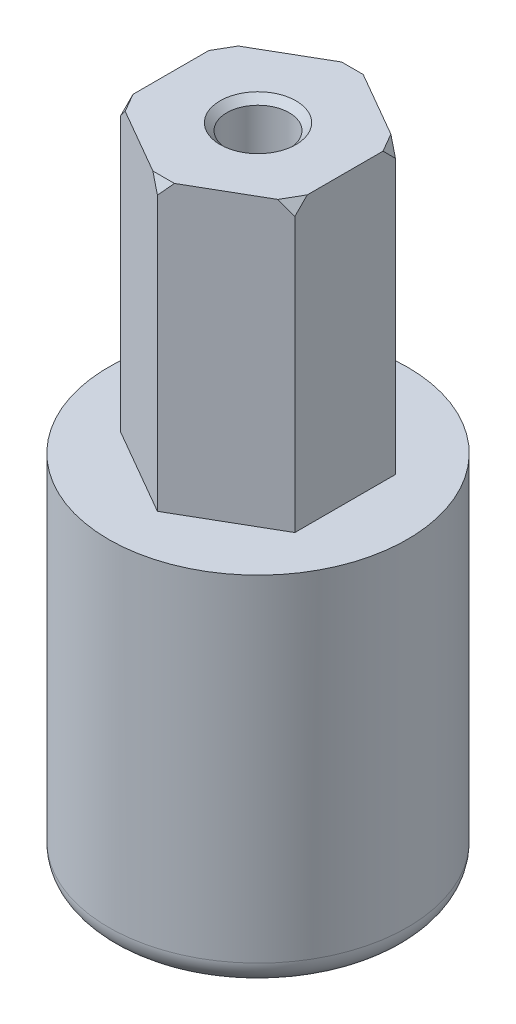
ISO-10303-21;
HEADER;
FILE_DESCRIPTION(('STEP AP214'),'2;1');
FILE_NAME('part.step','',(''),(''),'','','');
FILE_SCHEMA(('AUTOMOTIVE_DESIGN { 1 0 10303 214 1 1 1 1 }'));
ENDSEC;
DATA;
#1=APPLICATION_CONTEXT('core data for automotive mechanical design processes');
#2=APPLICATION_PROTOCOL_DEFINITION('international standard','automotive_design',2000,#1);
#3=PRODUCT_CONTEXT('',#1,'mechanical');
#4=PRODUCT('Part','Part','',(#3));
#5=PRODUCT_RELATED_PRODUCT_CATEGORY('part','',(#4));
#6=PRODUCT_DEFINITION_FORMATION('','',#4);
#7=PRODUCT_DEFINITION_CONTEXT('part definition',#1,'design');
#8=PRODUCT_DEFINITION('design','',#6,#7);
#9=PRODUCT_DEFINITION_SHAPE('','',#8);
#10=(LENGTH_UNIT() NAMED_UNIT(*) SI_UNIT(.MILLI.,.METRE.));
#11=(NAMED_UNIT(*) PLANE_ANGLE_UNIT() SI_UNIT($,.RADIAN.));
#12=(NAMED_UNIT(*) SI_UNIT($,.STERADIAN.) SOLID_ANGLE_UNIT());
#13=UNCERTAINTY_MEASURE_WITH_UNIT(LENGTH_MEASURE(1.E-05),#10,'distance_accuracy_value','');
#14=(GEOMETRIC_REPRESENTATION_CONTEXT(3) GLOBAL_UNCERTAINTY_ASSIGNED_CONTEXT((#13)) GLOBAL_UNIT_ASSIGNED_CONTEXT((#10,
#11,#12)) REPRESENTATION_CONTEXT('',''));
#15=CARTESIAN_POINT('',(0.,0.,0.));
#16=DIRECTION('',(0.,0.,1.));
#17=DIRECTION('',(1.,0.,0.));
#18=AXIS2_PLACEMENT_3D('',#15,#16,#17);
#19=CARTESIAN_POINT('',(3.5,14.5,-2.02072594216369));
#20=DIRECTION('',(0.5,0.,-0.866025403784438));
#21=DIRECTION('',(-0.866025403784438,0.,-0.5));
#22=AXIS2_PLACEMENT_3D('',#19,#20,#21);
#23=PLANE('',#22);
#24=DIRECTION('',(0.,1.,0.));
#25=VECTOR('',#24,1.);
#26=CARTESIAN_POINT('',(0.,14.5,-4.04145188432738));
#27=LINE('',#26,#25);
#28=CARTESIAN_POINT('',(0.,14.5,-4.04145188432738));
#29=VERTEX_POINT('',#28);
#30=CARTESIAN_POINT('',(0.,25.5,-4.04145188432738));
#31=VERTEX_POINT('',#30);
#32=EDGE_CURVE('E192',#29,#31,#27,.T.);
#33=ORIENTED_EDGE('',*,*,#32,.T.);
#34=DIRECTION('',(0.612372435695793,0.70710678118655,0.353553390593273));
#35=VECTOR('',#34,1.);
#36=CARTESIAN_POINT('',(-3.01313972081442,22.0207259421637,-5.78108891324554));
#37=LINE('',#36,#35);
#38=CARTESIAN_POINT('',(0.433012701892216,26.,-3.79145188432738));
#39=VERTEX_POINT('',#38);
#40=EDGE_CURVE('E11',#31,#39,#37,.T.);
#41=ORIENTED_EDGE('',*,*,#40,.T.);
#42=DIRECTION('',(-0.866025403784439,0.,-0.5));
#43=VECTOR('',#42,1.);
#44=CARTESIAN_POINT('',(3.5,26.,-2.02072594216369));
#45=LINE('',#44,#43);
#46=CARTESIAN_POINT('',(3.06698729810779,26.,-2.27072594216369));
#47=VERTEX_POINT('',#46);
#48=EDGE_CURVE('E144',#47,#39,#45,.T.);
#49=ORIENTED_EDGE('',*,*,#48,.F.);
#50=DIRECTION('',(0.612372435695793,-0.707106781186549,0.353553390593273));
#51=VECTOR('',#50,1.);
#52=CARTESIAN_POINT('',(8.26313972081442,20.,0.729274057836312));
#53=LINE('',#52,#51);
#54=CARTESIAN_POINT('',(3.5,25.5,-2.02072594216369));
#55=VERTEX_POINT('',#54);
#56=EDGE_CURVE('E226',#47,#55,#53,.T.);
#57=ORIENTED_EDGE('',*,*,#56,.T.);
#58=DIRECTION('',(0.,1.,0.));
#59=VECTOR('',#58,1.);
#60=CARTESIAN_POINT('',(3.5,14.5,-2.02072594216369));
#61=LINE('',#60,#59);
#62=CARTESIAN_POINT('',(3.5,14.5,-2.02072594216369));
#63=VERTEX_POINT('',#62);
#64=EDGE_CURVE('E169',#63,#55,#61,.T.);
#65=ORIENTED_EDGE('',*,*,#64,.F.);
#66=DIRECTION('',(-0.866025403784439,0.,-0.5));
#67=VECTOR('',#66,1.);
#68=CARTESIAN_POINT('',(3.5,14.5,-2.02072594216369));
#69=LINE('',#68,#67);
#70=EDGE_CURVE('E154',#63,#29,#69,.T.);
#71=ORIENTED_EDGE('',*,*,#70,.T.);
#72=EDGE_LOOP('',(#33,#41,#49,#57,#65,#71));
#73=FACE_BOUND('',#72,.T.);
#74=ADVANCED_FACE('F41',(#73),#23,.T.);
#75=CARTESIAN_POINT('',(0.,26.,-6.));
#76=DIRECTION('',(0.,1.,0.));
#77=DIRECTION('',(0.,0.,1.));
#78=AXIS2_PLACEMENT_3D('',#75,#76,#77);
#79=PLANE('',#78);
#80=CARTESIAN_POINT('',(0.,26.,0.));
#81=DIRECTION('',(0.,1.,0.));
#82=DIRECTION('',(0.,0.,1.));
#83=AXIS2_PLACEMENT_3D('',#80,#81,#82);
#84=CIRCLE('',#83,1.525);
#85=CARTESIAN_POINT('',(0.,26.,1.525));
#86=VERTEX_POINT('',#85);
#87=EDGE_CURVE('E147',#86,#86,#84,.T.);
#88=ORIENTED_EDGE('',*,*,#87,.F.);
#89=EDGE_LOOP('',(#88));
#90=FACE_BOUND('',#89,.T.);
#91=ORIENTED_EDGE('',*,*,#48,.T.);
#92=DIRECTION('',(-1.,0.,0.));
#93=VECTOR('',#92,1.);
#94=CARTESIAN_POINT('',(0.,26.,-3.79145188432738));
#95=LINE('',#94,#93);
#96=CARTESIAN_POINT('',(-0.433012701892214,26.,-3.79145188432738));
#97=VERTEX_POINT('',#96);
#98=EDGE_CURVE('E49',#39,#97,#95,.T.);
#99=ORIENTED_EDGE('',*,*,#98,.T.);
#100=DIRECTION('',(-0.866025403784438,0.,0.5));
#101=VECTOR('',#100,1.);
#102=CARTESIAN_POINT('',(0.,26.,-4.04145188432738));
#103=LINE('',#102,#101);
#104=CARTESIAN_POINT('',(-3.06698729810778,26.,-2.27072594216369));
#105=VERTEX_POINT('',#104);
#106=EDGE_CURVE('E61',#97,#105,#103,.T.);
#107=ORIENTED_EDGE('',*,*,#106,.T.);
#108=DIRECTION('',(-0.5,0.,0.866025403784439));
#109=VECTOR('',#108,1.);
#110=CARTESIAN_POINT('',(-0.685417437700576,26.,-6.39572594216369));
#111=LINE('',#110,#109);
#112=CARTESIAN_POINT('',(-3.5,26.,-1.52072594216369));
#113=VERTEX_POINT('',#112);
#114=EDGE_CURVE('E250',#105,#113,#111,.T.);
#115=ORIENTED_EDGE('',*,*,#114,.T.);
#116=DIRECTION('',(0.,0.,1.));
#117=VECTOR('',#116,1.);
#118=CARTESIAN_POINT('',(-3.5,26.,-2.02072594216369));
#119=LINE('',#118,#117);
#120=CARTESIAN_POINT('',(-3.5,26.,1.5207259421637));
#121=VERTEX_POINT('',#120);
#122=EDGE_CURVE('E174',#113,#121,#119,.T.);
#123=ORIENTED_EDGE('',*,*,#122,.T.);
#124=DIRECTION('',(0.5,0.,0.866025403784439));
#125=VECTOR('',#124,1.);
#126=CARTESIAN_POINT('',(-5.88156986040721,26.,-2.60427405783631));
#127=LINE('',#126,#125);
#128=CARTESIAN_POINT('',(-3.06698729810778,26.,2.27072594216369));
#129=VERTEX_POINT('',#128);
#130=EDGE_CURVE('E241',#121,#129,#127,.T.);
#131=ORIENTED_EDGE('',*,*,#130,.T.);
#132=DIRECTION('',(0.866025403784438,0.,0.5));
#133=VECTOR('',#132,1.);
#134=CARTESIAN_POINT('',(-3.5,26.,2.02072594216369));
#135=LINE('',#134,#133);
#136=CARTESIAN_POINT('',(-0.433012701892229,26.,3.79145188432738));
#137=VERTEX_POINT('',#136);
#138=EDGE_CURVE('E176',#129,#137,#135,.T.);
#139=ORIENTED_EDGE('',*,*,#138,.T.);
#140=DIRECTION('',(1.,0.,0.));
#141=VECTOR('',#140,1.);
#142=CARTESIAN_POINT('',(0.,26.,3.79145188432737));
#143=LINE('',#142,#141);
#144=CARTESIAN_POINT('',(0.433012701892234,26.,3.79145188432737));
#145=VERTEX_POINT('',#144);
#146=EDGE_CURVE('E229',#137,#145,#143,.T.);
#147=ORIENTED_EDGE('',*,*,#146,.T.);
#148=DIRECTION('',(0.866025403784439,0.,-0.5));
#149=VECTOR('',#148,1.);
#150=CARTESIAN_POINT('',(0.,26.,4.04145188432738));
#151=LINE('',#150,#149);
#152=CARTESIAN_POINT('',(3.06698729810778,26.,2.2707259421637));
#153=VERTEX_POINT('',#152);
#154=EDGE_CURVE('E155',#145,#153,#151,.T.);
#155=ORIENTED_EDGE('',*,*,#154,.T.);
#156=DIRECTION('',(0.5,0.,-0.866025403784439));
#157=VECTOR('',#156,1.);
#158=CARTESIAN_POINT('',(5.88156986040721,26.,-2.60427405783631));
#159=LINE('',#158,#157);
#160=CARTESIAN_POINT('',(3.5,26.,1.5207259421637));
#161=VERTEX_POINT('',#160);
#162=EDGE_CURVE('E217',#153,#161,#159,.T.);
#163=ORIENTED_EDGE('',*,*,#162,.T.);
#164=DIRECTION('',(0.,0.,-1.));
#165=VECTOR('',#164,1.);
#166=CARTESIAN_POINT('',(3.5,26.,2.02072594216369));
#167=LINE('',#166,#165);
#168=CARTESIAN_POINT('',(3.5,26.,-1.52072594216369));
#169=VERTEX_POINT('',#168);
#170=EDGE_CURVE('E140',#161,#169,#167,.T.);
#171=ORIENTED_EDGE('',*,*,#170,.T.);
#172=DIRECTION('',(-0.5,0.,-0.866025403784439));
#173=VECTOR('',#172,1.);
#174=CARTESIAN_POINT('',(0.685417437700577,26.,-6.39572594216369));
#175=LINE('',#174,#173);
#176=EDGE_CURVE('E220',#169,#47,#175,.T.);
#177=ORIENTED_EDGE('',*,*,#176,.T.);
#178=EDGE_LOOP('',(#91,#99,#107,#115,#123,#131,#139,#147,#155,#163,#171,#177));
#179=FACE_BOUND('',#178,.T.);
#180=ADVANCED_FACE('F257',(#90,#179),#79,.T.);
#181=CARTESIAN_POINT('',(0.,14.5,-4.04145188432738));
#182=DIRECTION('',(-0.5,0.,-0.866025403784438));
#183=DIRECTION('',(-0.866025403784439,0.,0.5));
#184=AXIS2_PLACEMENT_3D('',#181,#182,#183);
#185=PLANE('',#184);
#186=ORIENTED_EDGE('',*,*,#106,.F.);
#187=DIRECTION('',(0.612372435695793,-0.707106781186549,-0.353553390593273));
#188=VECTOR('',#187,1.);
#189=CARTESIAN_POINT('',(4.76313972081442,20.,-6.79145188432738));
#190=LINE('',#189,#188);
#191=EDGE_CURVE('E255',#97,#31,#190,.T.);
#192=ORIENTED_EDGE('',*,*,#191,.T.);
#193=ORIENTED_EDGE('',*,*,#32,.F.);
#194=DIRECTION('',(-0.866025403784438,0.,0.5));
#195=VECTOR('',#194,1.);
#196=CARTESIAN_POINT('',(0.,14.5,-4.04145188432738));
#197=LINE('',#196,#195);
#198=CARTESIAN_POINT('',(-3.5,14.5,-2.02072594216369));
#199=VERTEX_POINT('',#198);
#200=EDGE_CURVE('E158',#29,#199,#197,.T.);
#201=ORIENTED_EDGE('',*,*,#200,.T.);
#202=DIRECTION('',(0.,1.,0.));
#203=VECTOR('',#202,1.);
#204=CARTESIAN_POINT('',(-3.5,14.5,-2.02072594216369));
#205=LINE('',#204,#203);
#206=CARTESIAN_POINT('',(-3.5,25.5,-2.02072594216369));
#207=VERTEX_POINT('',#206);
#208=EDGE_CURVE('E189',#199,#207,#205,.T.);
#209=ORIENTED_EDGE('',*,*,#208,.T.);
#210=DIRECTION('',(0.612372435695793,0.707106781186549,-0.353553390593273));
#211=VECTOR('',#210,1.);
#212=CARTESIAN_POINT('',(-6.51313972081442,22.0207259421637,-0.281088913245531));
#213=LINE('',#212,#211);
#214=EDGE_CURVE('E252',#207,#105,#213,.T.);
#215=ORIENTED_EDGE('',*,*,#214,.T.);
#216=EDGE_LOOP('',(#186,#192,#193,#201,#209,#215));
#217=FACE_BOUND('',#216,.T.);
#218=ADVANCED_FACE('F260',(#217),#185,.T.);
#219=CARTESIAN_POINT('',(-3.5,14.5,-2.02072594216369));
#220=DIRECTION('',(-1.,0.,0.));
#221=DIRECTION('',(0.,0.,1.));
#222=AXIS2_PLACEMENT_3D('',#219,#220,#221);
#223=PLANE('',#222);
#224=ORIENTED_EDGE('',*,*,#122,.F.);
#225=DIRECTION('',(0.,-0.707106781186549,-0.707106781186546));
#226=VECTOR('',#225,1.);
#227=CARTESIAN_POINT('',(-3.5,20.,-7.52072594216369));
#228=LINE('',#227,#226);
#229=EDGE_CURVE('E247',#113,#207,#228,.T.);
#230=ORIENTED_EDGE('',*,*,#229,.T.);
#231=ORIENTED_EDGE('',*,*,#208,.F.);
#232=DIRECTION('',(0.,0.,1.));
#233=VECTOR('',#232,1.);
#234=CARTESIAN_POINT('',(-3.5,14.5,-2.02072594216369));
#235=LINE('',#234,#233);
#236=CARTESIAN_POINT('',(-3.5,14.5,2.02072594216369));
#237=VERTEX_POINT('',#236);
#238=EDGE_CURVE('E161',#199,#237,#235,.T.);
#239=ORIENTED_EDGE('',*,*,#238,.T.);
#240=DIRECTION('',(0.,1.,0.));
#241=VECTOR('',#240,1.);
#242=CARTESIAN_POINT('',(-3.5,14.5,2.02072594216369));
#243=LINE('',#242,#241);
#244=CARTESIAN_POINT('',(-3.5,25.5,2.02072594216369));
#245=VERTEX_POINT('',#244);
#246=EDGE_CURVE('E186',#237,#245,#243,.T.);
#247=ORIENTED_EDGE('',*,*,#246,.T.);
#248=DIRECTION('',(0.,0.707106781186549,-0.707106781186546));
#249=VECTOR('',#248,1.);
#250=CARTESIAN_POINT('',(-3.5,22.0207259421637,5.50000000000001));
#251=LINE('',#250,#249);
#252=EDGE_CURVE('E244',#245,#121,#251,.T.);
#253=ORIENTED_EDGE('',*,*,#252,.T.);
#254=EDGE_LOOP('',(#224,#230,#231,#239,#247,#253));
#255=FACE_BOUND('',#254,.T.);
#256=ADVANCED_FACE('F266',(#255),#223,.T.);
#257=CARTESIAN_POINT('',(-3.5,14.5,2.02072594216369));
#258=DIRECTION('',(-0.5,0.,0.866025403784439));
#259=DIRECTION('',(0.866025403784438,0.,0.5));
#260=AXIS2_PLACEMENT_3D('',#257,#258,#259);
#261=PLANE('',#260);
#262=ORIENTED_EDGE('',*,*,#138,.F.);
#263=DIRECTION('',(-0.612372435695793,-0.707106781186549,-0.353553390593273));
#264=VECTOR('',#263,1.);
#265=CARTESIAN_POINT('',(-8.26313972081441,20.,-0.729274057836308));
#266=LINE('',#265,#264);
#267=EDGE_CURVE('E238',#129,#245,#266,.T.);
#268=ORIENTED_EDGE('',*,*,#267,.T.);
#269=ORIENTED_EDGE('',*,*,#246,.F.);
#270=DIRECTION('',(0.866025403784438,0.,0.5));
#271=VECTOR('',#270,1.);
#272=CARTESIAN_POINT('',(-3.5,14.5,2.02072594216369));
#273=LINE('',#272,#271);
#274=CARTESIAN_POINT('',(0.,14.5,4.04145188432738));
#275=VERTEX_POINT('',#274);
#276=EDGE_CURVE('E164',#237,#275,#273,.T.);
#277=ORIENTED_EDGE('',*,*,#276,.T.);
#278=DIRECTION('',(0.,1.,0.));
#279=VECTOR('',#278,1.);
#280=CARTESIAN_POINT('',(0.,14.5,4.04145188432738));
#281=LINE('',#280,#279);
#282=CARTESIAN_POINT('',(0.,25.5,4.04145188432738));
#283=VERTEX_POINT('',#282);
#284=EDGE_CURVE('E183',#275,#283,#281,.T.);
#285=ORIENTED_EDGE('',*,*,#284,.T.);
#286=DIRECTION('',(-0.612372435695793,0.707106781186549,-0.353553390593273));
#287=VECTOR('',#286,1.);
#288=CARTESIAN_POINT('',(3.01313972081441,22.0207259421637,5.78108891324554));
#289=LINE('',#288,#287);
#290=EDGE_CURVE('E235',#283,#137,#289,.T.);
#291=ORIENTED_EDGE('',*,*,#290,.T.);
#292=EDGE_LOOP('',(#262,#268,#269,#277,#285,#291));
#293=FACE_BOUND('',#292,.T.);
#294=ADVANCED_FACE('F273',(#293),#261,.T.);
#295=CARTESIAN_POINT('',(0.,14.5,4.04145188432738));
#296=DIRECTION('',(0.5,0.,0.866025403784439));
#297=DIRECTION('',(0.866025403784439,0.,-0.5));
#298=AXIS2_PLACEMENT_3D('',#295,#296,#297);
#299=PLANE('',#298);
#300=ORIENTED_EDGE('',*,*,#154,.F.);
#301=DIRECTION('',(-0.612372435695793,-0.70710678118655,0.353553390593273));
#302=VECTOR('',#301,1.);
#303=CARTESIAN_POINT('',(-4.76313972081441,20.,6.79145188432738));
#304=LINE('',#303,#302);
#305=EDGE_CURVE('E232',#145,#283,#304,.T.);
#306=ORIENTED_EDGE('',*,*,#305,.T.);
#307=ORIENTED_EDGE('',*,*,#284,.F.);
#308=DIRECTION('',(0.866025403784439,0.,-0.5));
#309=VECTOR('',#308,1.);
#310=CARTESIAN_POINT('',(0.,14.5,4.04145188432738));
#311=LINE('',#310,#309);
#312=CARTESIAN_POINT('',(3.5,14.5,2.02072594216369));
#313=VERTEX_POINT('',#312);
#314=EDGE_CURVE('E167',#275,#313,#311,.T.);
#315=ORIENTED_EDGE('',*,*,#314,.T.);
#316=DIRECTION('',(0.,1.,0.));
#317=VECTOR('',#316,1.);
#318=CARTESIAN_POINT('',(3.5,14.5,2.02072594216369));
#319=LINE('',#318,#317);
#320=CARTESIAN_POINT('',(3.5,25.5,2.02072594216369));
#321=VERTEX_POINT('',#320);
#322=EDGE_CURVE('E179',#313,#321,#319,.T.);
#323=ORIENTED_EDGE('',*,*,#322,.T.);
#324=DIRECTION('',(-0.612372435695793,0.707106781186549,0.353553390593273));
#325=VECTOR('',#324,1.);
#326=CARTESIAN_POINT('',(6.51313972081442,22.0207259421637,0.281088913245533));
#327=LINE('',#326,#325);
#328=EDGE_CURVE('E214',#321,#153,#327,.T.);
#329=ORIENTED_EDGE('',*,*,#328,.T.);
#330=EDGE_LOOP('',(#300,#306,#307,#315,#323,#329));
#331=FACE_BOUND('',#330,.T.);
#332=ADVANCED_FACE('F287',(#331),#299,.T.);
#333=CARTESIAN_POINT('',(3.5,14.5,2.02072594216369));
#334=DIRECTION('',(1.,0.,0.));
#335=DIRECTION('',(0.,0.,-1.));
#336=AXIS2_PLACEMENT_3D('',#333,#334,#335);
#337=PLANE('',#336);
#338=ORIENTED_EDGE('',*,*,#64,.T.);
#339=DIRECTION('',(0.,0.707106781186549,0.707106781186546));
#340=VECTOR('',#339,1.);
#341=CARTESIAN_POINT('',(3.5,22.0207259421637,-5.50000000000001));
#342=LINE('',#341,#340);
#343=EDGE_CURVE('E223',#55,#169,#342,.T.);
#344=ORIENTED_EDGE('',*,*,#343,.T.);
#345=ORIENTED_EDGE('',*,*,#170,.F.);
#346=DIRECTION('',(0.,-0.707106781186549,0.707106781186546));
#347=VECTOR('',#346,1.);
#348=CARTESIAN_POINT('',(3.5,20.,7.52072594216369));
#349=LINE('',#348,#347);
#350=EDGE_CURVE('E211',#161,#321,#349,.T.);
#351=ORIENTED_EDGE('',*,*,#350,.T.);
#352=ORIENTED_EDGE('',*,*,#322,.F.);
#353=DIRECTION('',(0.,0.,-1.));
#354=VECTOR('',#353,1.);
#355=CARTESIAN_POINT('',(3.5,14.5,2.02072594216369));
#356=LINE('',#355,#354);
#357=EDGE_CURVE('E151',#313,#63,#356,.T.);
#358=ORIENTED_EDGE('',*,*,#357,.T.);
#359=EDGE_LOOP('',(#338,#344,#345,#351,#352,#358));
#360=FACE_BOUND('',#359,.T.);
#361=ADVANCED_FACE('F283',(#360),#337,.T.);
#362=CARTESIAN_POINT('',(0.,0.,0.));
#363=DIRECTION('',(0.,-1.,0.));
#364=DIRECTION('',(0.,0.,-1.));
#365=AXIS2_PLACEMENT_3D('',#362,#363,#364);
#366=CYLINDRICAL_SURFACE('',#365,6.);
#367=CARTESIAN_POINT('',(0.,1.,0.));
#368=DIRECTION('',(0.,-1.,0.));
#369=DIRECTION('',(0.,0.,-1.));
#370=AXIS2_PLACEMENT_3D('',#367,#368,#369);
#371=CIRCLE('',#370,6.);
#372=CARTESIAN_POINT('',(0.,1.,-6.));
#373=VERTEX_POINT('',#372);
#374=EDGE_CURVE('E208',#373,#373,#371,.F.);
#375=ORIENTED_EDGE('',*,*,#374,.T.);
#376=EDGE_LOOP('',(#375));
#377=FACE_BOUND('',#376,.T.);
#378=CARTESIAN_POINT('',(0.,14.5,0.));
#379=DIRECTION('',(0.,1.,0.));
#380=DIRECTION('',(0.,0.,1.));
#381=AXIS2_PLACEMENT_3D('',#378,#379,#380);
#382=CIRCLE('',#381,6.);
#383=CARTESIAN_POINT('',(0.,14.5,6.));
#384=VERTEX_POINT('',#383);
#385=EDGE_CURVE('E182',#384,#384,#382,.T.);
#386=ORIENTED_EDGE('',*,*,#385,.F.);
#387=EDGE_LOOP('',(#386));
#388=FACE_BOUND('',#387,.T.);
#389=ADVANCED_FACE('F318',(#377,#388),#366,.T.);
#390=CARTESIAN_POINT('',(0.,13.,0.));
#391=DIRECTION('',(0.,-1.,0.));
#392=DIRECTION('',(0.,0.,-1.));
#393=AXIS2_PLACEMENT_3D('',#390,#391,#392);
#394=PLANE('',#393);
#395=CARTESIAN_POINT('',(0.,13.,0.));
#396=DIRECTION('',(0.,-1.,0.));
#397=DIRECTION('',(0.,0.,-1.));
#398=AXIS2_PLACEMENT_3D('',#395,#396,#397);
#399=CIRCLE('',#398,3.);
#400=CARTESIAN_POINT('',(0.,13.,-3.));
#401=VERTEX_POINT('',#400);
#402=EDGE_CURVE('E202',#401,#401,#399,.T.);
#403=ORIENTED_EDGE('',*,*,#402,.T.);
#404=EDGE_LOOP('',(#403));
#405=FACE_BOUND('',#404,.T.);
#406=ADVANCED_FACE('F324',(#405),#394,.T.);
#407=CARTESIAN_POINT('',(0.,0.,0.));
#408=DIRECTION('',(0.,-1.,0.));
#409=DIRECTION('',(0.,0.,-1.));
#410=AXIS2_PLACEMENT_3D('',#407,#408,#409);
#411=CYLINDRICAL_SURFACE('',#410,3.);
#412=CARTESIAN_POINT('',(0.,0.,0.));
#413=DIRECTION('',(0.,-1.,0.));
#414=DIRECTION('',(0.,0.,-1.));
#415=AXIS2_PLACEMENT_3D('',#412,#413,#414);
#416=CIRCLE('',#415,3.);
#417=CARTESIAN_POINT('',(0.,0.,-3.));
#418=VERTEX_POINT('',#417);
#419=EDGE_CURVE('E199',#418,#418,#416,.T.);
#420=ORIENTED_EDGE('',*,*,#419,.T.);
#421=EDGE_LOOP('',(#420));
#422=FACE_BOUND('',#421,.T.);
#423=ORIENTED_EDGE('',*,*,#402,.F.);
#424=EDGE_LOOP('',(#423));
#425=FACE_BOUND('',#424,.T.);
#426=ADVANCED_FACE('F328',(#422,#425),#411,.F.);
#427=CARTESIAN_POINT('',(0.,0.,-6.));
#428=DIRECTION('',(0.,-1.,0.));
#429=DIRECTION('',(0.,0.,-1.));
#430=AXIS2_PLACEMENT_3D('',#427,#428,#429);
#431=PLANE('',#430);
#432=CARTESIAN_POINT('',(0.,0.,0.));
#433=DIRECTION('',(0.,-1.,0.));
#434=DIRECTION('',(0.,0.,-1.));
#435=AXIS2_PLACEMENT_3D('',#432,#433,#434);
#436=CIRCLE('',#435,5.);
#437=CARTESIAN_POINT('',(0.,0.,-5.));
#438=VERTEX_POINT('',#437);
#439=EDGE_CURVE('E205',#438,#438,#436,.T.);
#440=ORIENTED_EDGE('',*,*,#439,.T.);
#441=EDGE_LOOP('',(#440));
#442=FACE_BOUND('',#441,.T.);
#443=ORIENTED_EDGE('',*,*,#419,.F.);
#444=EDGE_LOOP('',(#443));
#445=FACE_BOUND('',#444,.T.);
#446=ADVANCED_FACE('F320',(#442,#445),#431,.T.);
#447=CARTESIAN_POINT('',(0.,14.5,0.));
#448=DIRECTION('',(0.,1.,0.));
#449=DIRECTION('',(0.,0.,1.));
#450=AXIS2_PLACEMENT_3D('',#447,#448,#449);
#451=PLANE('',#450);
#452=ORIENTED_EDGE('',*,*,#314,.F.);
#453=ORIENTED_EDGE('',*,*,#276,.F.);
#454=ORIENTED_EDGE('',*,*,#238,.F.);
#455=ORIENTED_EDGE('',*,*,#200,.F.);
#456=ORIENTED_EDGE('',*,*,#70,.F.);
#457=ORIENTED_EDGE('',*,*,#357,.F.);
#458=EDGE_LOOP('',(#452,#453,#454,#455,#456,#457));
#459=FACE_BOUND('',#458,.T.);
#460=ORIENTED_EDGE('',*,*,#385,.T.);
#461=EDGE_LOOP('',(#460));
#462=FACE_BOUND('',#461,.T.);
#463=ADVANCED_FACE('F277',(#459,#462),#451,.T.);
#464=CARTESIAN_POINT('',(0.,1.,0.));
#465=DIRECTION('',(0.,-1.,0.));
#466=DIRECTION('',(0.,0.,-1.));
#467=AXIS2_PLACEMENT_3D('',#464,#465,#466);
#468=TOROIDAL_SURFACE('',#467,5.,1.);
#469=ORIENTED_EDGE('',*,*,#374,.F.);
#470=EDGE_LOOP('',(#469));
#471=FACE_BOUND('',#470,.T.);
#472=ORIENTED_EDGE('',*,*,#439,.F.);
#473=EDGE_LOOP('',(#472));
#474=FACE_BOUND('',#473,.T.);
#475=ADVANCED_FACE('F43',(#471,#474),#468,.T.);
#476=CARTESIAN_POINT('',(11.6334591186013,6.71658075373091,6.71658075373094));
#477=DIRECTION('',(0.774596669241484,0.447213595499956,0.447213595499958));
#478=DIRECTION('',(0.5,0.,-0.866025403784439));
#479=AXIS2_PLACEMENT_3D('',#476,#477,#478);
#480=PLANE('',#479);
#481=ORIENTED_EDGE('',*,*,#350,.F.);
#482=ORIENTED_EDGE('',*,*,#162,.F.);
#483=ORIENTED_EDGE('',*,*,#328,.F.);
#484=EDGE_LOOP('',(#481,#482,#483));
#485=FACE_BOUND('',#484,.T.);
#486=ADVANCED_FACE('F293',(#485),#480,.T.);
#487=CARTESIAN_POINT('',(11.6334591186013,6.71658075373091,-6.71658075373094));
#488=DIRECTION('',(0.774596669241484,0.447213595499956,-0.447213595499958));
#489=DIRECTION('',(-0.5,0.,-0.866025403784439));
#490=AXIS2_PLACEMENT_3D('',#487,#488,#489);
#491=PLANE('',#490);
#492=ORIENTED_EDGE('',*,*,#176,.F.);
#493=ORIENTED_EDGE('',*,*,#343,.F.);
#494=ORIENTED_EDGE('',*,*,#56,.F.);
#495=EDGE_LOOP('',(#492,#493,#494));
#496=FACE_BOUND('',#495,.T.);
#497=ADVANCED_FACE('F295',(#496),#491,.T.);
#498=CARTESIAN_POINT('',(0.,6.71658075373089,13.4331615074619));
#499=DIRECTION('',(0.,0.447213595499956,0.894427190999917));
#500=DIRECTION('',(0.,-0.894427190999917,0.447213595499956));
#501=AXIS2_PLACEMENT_3D('',#498,#499,#500);
#502=PLANE('',#501);
#503=ORIENTED_EDGE('',*,*,#146,.F.);
#504=ORIENTED_EDGE('',*,*,#290,.F.);
#505=ORIENTED_EDGE('',*,*,#305,.F.);
#506=EDGE_LOOP('',(#503,#504,#505));
#507=FACE_BOUND('',#506,.T.);
#508=ADVANCED_FACE('F290',(#507),#502,.T.);
#509=CARTESIAN_POINT('',(-11.6334591186013,6.71658075373091,6.71658075373093));
#510=DIRECTION('',(-0.774596669241484,0.447213595499956,0.447213595499958));
#511=DIRECTION('',(0.5,0.,0.866025403784439));
#512=AXIS2_PLACEMENT_3D('',#509,#510,#511);
#513=PLANE('',#512);
#514=ORIENTED_EDGE('',*,*,#267,.F.);
#515=ORIENTED_EDGE('',*,*,#130,.F.);
#516=ORIENTED_EDGE('',*,*,#252,.F.);
#517=EDGE_LOOP('',(#514,#515,#516));
#518=FACE_BOUND('',#517,.T.);
#519=ADVANCED_FACE('F271',(#518),#513,.T.);
#520=CARTESIAN_POINT('',(-11.6334591186013,6.71658075373091,-6.71658075373093));
#521=DIRECTION('',(-0.774596669241484,0.447213595499956,-0.447213595499958));
#522=DIRECTION('',(-0.5,0.,0.866025403784439));
#523=AXIS2_PLACEMENT_3D('',#520,#521,#522);
#524=PLANE('',#523);
#525=ORIENTED_EDGE('',*,*,#229,.F.);
#526=ORIENTED_EDGE('',*,*,#114,.F.);
#527=ORIENTED_EDGE('',*,*,#214,.F.);
#528=EDGE_LOOP('',(#525,#526,#527));
#529=FACE_BOUND('',#528,.T.);
#530=ADVANCED_FACE('F263',(#529),#524,.T.);
#531=CARTESIAN_POINT('',(0.,6.7165807537309,-13.4331615074619));
#532=DIRECTION('',(0.,0.447213595499956,-0.894427190999917));
#533=DIRECTION('',(0.,0.894427190999917,0.447213595499956));
#534=AXIS2_PLACEMENT_3D('',#531,#532,#533);
#535=PLANE('',#534);
#536=ORIENTED_EDGE('',*,*,#191,.F.);
#537=ORIENTED_EDGE('',*,*,#98,.F.);
#538=ORIENTED_EDGE('',*,*,#40,.F.);
#539=EDGE_LOOP('',(#536,#537,#538));
#540=FACE_BOUND('',#539,.T.);
#541=ADVANCED_FACE('F134',(#540),#535,.T.);
#542=CARTESIAN_POINT('',(0.,18.5,0.));
#543=DIRECTION('',(0.,1.,0.));
#544=DIRECTION('',(0.,0.,1.));
#545=AXIS2_PLACEMENT_3D('',#542,#543,#544);
#546=CONICAL_SURFACE('',#545,1.25,1.02974425867665);
#547=CARTESIAN_POINT('',(0.,17.7489242262155,0.));
#548=VERTEX_POINT('',#547);
#549=VERTEX_LOOP('',#548);
#550=FACE_BOUND('',#549,.T.);
#551=CARTESIAN_POINT('',(0.,18.5,0.));
#552=DIRECTION('',(0.,1.,0.));
#553=DIRECTION('',(0.,0.,1.));
#554=AXIS2_PLACEMENT_3D('',#551,#552,#553);
#555=CIRCLE('',#554,1.25);
#556=CARTESIAN_POINT('',(0.,18.5,1.25));
#557=VERTEX_POINT('',#556);
#558=EDGE_CURVE('E138',#557,#557,#555,.T.);
#559=ORIENTED_EDGE('',*,*,#558,.T.);
#560=EDGE_LOOP('',(#559));
#561=FACE_BOUND('',#560,.T.);
#562=ADVANCED_FACE('F130',(#550,#561),#546,.F.);
#563=CARTESIAN_POINT('',(0.,26.,0.));
#564=DIRECTION('',(0.,1.,0.));
#565=DIRECTION('',(0.,0.,1.));
#566=AXIS2_PLACEMENT_3D('',#563,#564,#565);
#567=CYLINDRICAL_SURFACE('',#566,1.25);
#568=ORIENTED_EDGE('',*,*,#558,.F.);
#569=EDGE_LOOP('',(#568));
#570=FACE_BOUND('',#569,.T.);
#571=CARTESIAN_POINT('',(0.,25.725,0.));
#572=DIRECTION('',(0.,1.,0.));
#573=DIRECTION('',(0.,0.,1.));
#574=AXIS2_PLACEMENT_3D('',#571,#572,#573);
#575=CIRCLE('',#574,1.25);
#576=CARTESIAN_POINT('',(0.,25.725,1.25));
#577=VERTEX_POINT('',#576);
#578=EDGE_CURVE('E141',#577,#577,#575,.T.);
#579=ORIENTED_EDGE('',*,*,#578,.T.);
#580=EDGE_LOOP('',(#579));
#581=FACE_BOUND('',#580,.T.);
#582=ADVANCED_FACE('F133',(#570,#581),#567,.F.);
#583=CARTESIAN_POINT('',(0.,26.,0.));
#584=DIRECTION('',(0.,1.,0.));
#585=DIRECTION('',(0.,0.,1.));
#586=AXIS2_PLACEMENT_3D('',#583,#584,#585);
#587=CONICAL_SURFACE('',#586,1.525,0.785398163397448);
#588=ORIENTED_EDGE('',*,*,#578,.F.);
#589=EDGE_LOOP('',(#588));
#590=FACE_BOUND('',#589,.T.);
#591=ORIENTED_EDGE('',*,*,#87,.T.);
#592=EDGE_LOOP('',(#591));
#593=FACE_BOUND('',#592,.T.);
#594=ADVANCED_FACE('F459',(#590,#593),#587,.F.);
#595=CLOSED_SHELL('',(#74,#180,#218,#256,#294,#332,#361,#389,#406,#426,#446,#463,#475,#486,#497,
#508,#519,#530,#541,#562,#582,#594));
#596=MANIFOLD_SOLID_BREP('B2',#595);
#597=ADVANCED_BREP_SHAPE_REPRESENTATION('',(#18,#596),#14);
#598=SHAPE_DEFINITION_REPRESENTATION(#9,#597);
ENDSEC;
END-ISO-10303-21;
